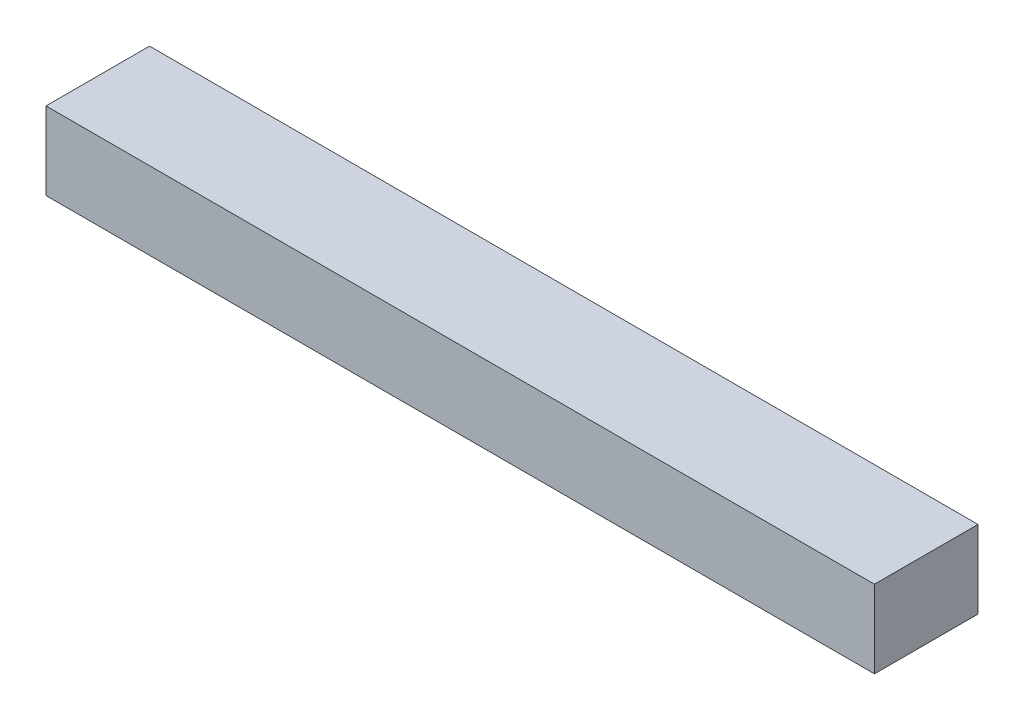
ISO-10303-21;
HEADER;
FILE_DESCRIPTION(('STEP AP214'),'2;1');
FILE_NAME('part.step','',(''),(''),'','','');
FILE_SCHEMA(('AUTOMOTIVE_DESIGN { 1 0 10303 214 1 1 1 1 }'));
ENDSEC;
DATA;
#1=APPLICATION_CONTEXT('core data for automotive mechanical design processes');
#2=APPLICATION_PROTOCOL_DEFINITION('international standard','automotive_design',2000,#1);
#3=PRODUCT_CONTEXT('',#1,'mechanical');
#4=PRODUCT('Part','Part','',(#3));
#5=PRODUCT_RELATED_PRODUCT_CATEGORY('part','',(#4));
#6=PRODUCT_DEFINITION_FORMATION('','',#4);
#7=PRODUCT_DEFINITION_CONTEXT('part definition',#1,'design');
#8=PRODUCT_DEFINITION('design','',#6,#7);
#9=PRODUCT_DEFINITION_SHAPE('','',#8);
#10=(LENGTH_UNIT() NAMED_UNIT(*) SI_UNIT(.MILLI.,.METRE.));
#11=(NAMED_UNIT(*) PLANE_ANGLE_UNIT() SI_UNIT($,.RADIAN.));
#12=(NAMED_UNIT(*) SI_UNIT($,.STERADIAN.) SOLID_ANGLE_UNIT());
#13=UNCERTAINTY_MEASURE_WITH_UNIT(LENGTH_MEASURE(1.E-05),#10,'distance_accuracy_value','');
#14=(GEOMETRIC_REPRESENTATION_CONTEXT(3) GLOBAL_UNCERTAINTY_ASSIGNED_CONTEXT((#13)) GLOBAL_UNIT_ASSIGNED_CONTEXT((#10,
#11,#12)) REPRESENTATION_CONTEXT('',''));
#15=CARTESIAN_POINT('',(0.,0.,0.));
#16=DIRECTION('',(0.,0.,1.));
#17=DIRECTION('',(1.,0.,0.));
#18=AXIS2_PLACEMENT_3D('',#15,#16,#17);
#19=CARTESIAN_POINT('',(-64.,-6.,-16.));
#20=DIRECTION('',(-1.,0.,0.));
#21=DIRECTION('',(0.,0.,1.));
#22=AXIS2_PLACEMENT_3D('',#19,#20,#21);
#23=PLANE('',#22);
#24=DIRECTION('',(0.,-1.,0.));
#25=VECTOR('',#24,1.);
#26=CARTESIAN_POINT('',(-64.,-6.,0.));
#27=LINE('',#26,#25);
#28=CARTESIAN_POINT('',(-64.,6.,0.));
#29=VERTEX_POINT('',#28);
#30=CARTESIAN_POINT('',(-64.,-6.,0.));
#31=VERTEX_POINT('',#30);
#32=EDGE_CURVE('E103',#29,#31,#27,.T.);
#33=ORIENTED_EDGE('',*,*,#32,.F.);
#34=DIRECTION('',(0.,0.,1.));
#35=VECTOR('',#34,1.);
#36=CARTESIAN_POINT('',(-64.,6.,-16.));
#37=LINE('',#36,#35);
#38=CARTESIAN_POINT('',(-64.,6.,-16.));
#39=VERTEX_POINT('',#38);
#40=EDGE_CURVE('E11',#39,#29,#37,.T.);
#41=ORIENTED_EDGE('',*,*,#40,.F.);
#42=DIRECTION('',(0.,-1.,0.));
#43=VECTOR('',#42,1.);
#44=CARTESIAN_POINT('',(-64.,-6.,-16.));
#45=LINE('',#44,#43);
#46=CARTESIAN_POINT('',(-64.,-6.,-16.));
#47=VERTEX_POINT('',#46);
#48=EDGE_CURVE('E97',#39,#47,#45,.T.);
#49=ORIENTED_EDGE('',*,*,#48,.T.);
#50=DIRECTION('',(0.,0.,1.));
#51=VECTOR('',#50,1.);
#52=CARTESIAN_POINT('',(-64.,-6.,-16.));
#53=LINE('',#52,#51);
#54=EDGE_CURVE('E42',#47,#31,#53,.T.);
#55=ORIENTED_EDGE('',*,*,#54,.T.);
#56=EDGE_LOOP('',(#33,#41,#49,#55));
#57=FACE_BOUND('',#56,.T.);
#58=ADVANCED_FACE('F39',(#57),#23,.T.);
#59=CARTESIAN_POINT('',(-64.,6.,-16.));
#60=DIRECTION('',(0.,1.,0.));
#61=DIRECTION('',(0.,0.,1.));
#62=AXIS2_PLACEMENT_3D('',#59,#60,#61);
#63=PLANE('',#62);
#64=DIRECTION('',(-1.,0.,0.));
#65=VECTOR('',#64,1.);
#66=CARTESIAN_POINT('',(-64.,6.,0.));
#67=LINE('',#66,#65);
#68=CARTESIAN_POINT('',(64.,6.,0.));
#69=VERTEX_POINT('',#68);
#70=EDGE_CURVE('E99',#69,#29,#67,.T.);
#71=ORIENTED_EDGE('',*,*,#70,.F.);
#72=DIRECTION('',(0.,0.,1.));
#73=VECTOR('',#72,1.);
#74=CARTESIAN_POINT('',(64.,6.,-16.));
#75=LINE('',#74,#73);
#76=CARTESIAN_POINT('',(64.,6.,-16.));
#77=VERTEX_POINT('',#76);
#78=EDGE_CURVE('E48',#77,#69,#75,.T.);
#79=ORIENTED_EDGE('',*,*,#78,.F.);
#80=DIRECTION('',(-1.,0.,0.));
#81=VECTOR('',#80,1.);
#82=CARTESIAN_POINT('',(-64.,6.,-16.));
#83=LINE('',#82,#81);
#84=EDGE_CURVE('E94',#77,#39,#83,.T.);
#85=ORIENTED_EDGE('',*,*,#84,.T.);
#86=ORIENTED_EDGE('',*,*,#40,.T.);
#87=EDGE_LOOP('',(#71,#79,#85,#86));
#88=FACE_BOUND('',#87,.T.);
#89=ADVANCED_FACE('F113',(#88),#63,.T.);
#90=CARTESIAN_POINT('',(64.,-6.,-16.));
#91=DIRECTION('',(1.,0.,0.));
#92=DIRECTION('',(0.,0.,-1.));
#93=AXIS2_PLACEMENT_3D('',#90,#91,#92);
#94=PLANE('',#93);
#95=DIRECTION('',(0.,1.,0.));
#96=VECTOR('',#95,1.);
#97=CARTESIAN_POINT('',(64.,-6.,0.));
#98=LINE('',#97,#96);
#99=CARTESIAN_POINT('',(64.,-6.,0.));
#100=VERTEX_POINT('',#99);
#101=EDGE_CURVE('E89',#100,#69,#98,.T.);
#102=ORIENTED_EDGE('',*,*,#101,.F.);
#103=DIRECTION('',(0.,0.,1.));
#104=VECTOR('',#103,1.);
#105=CARTESIAN_POINT('',(64.,-6.,-16.));
#106=LINE('',#105,#104);
#107=CARTESIAN_POINT('',(64.,-6.,-16.));
#108=VERTEX_POINT('',#107);
#109=EDGE_CURVE('E84',#108,#100,#106,.T.);
#110=ORIENTED_EDGE('',*,*,#109,.F.);
#111=DIRECTION('',(0.,1.,0.));
#112=VECTOR('',#111,1.);
#113=CARTESIAN_POINT('',(64.,-6.,-16.));
#114=LINE('',#113,#112);
#115=EDGE_CURVE('E87',#108,#77,#114,.T.);
#116=ORIENTED_EDGE('',*,*,#115,.T.);
#117=ORIENTED_EDGE('',*,*,#78,.T.);
#118=EDGE_LOOP('',(#102,#110,#116,#117));
#119=FACE_BOUND('',#118,.T.);
#120=ADVANCED_FACE('F86',(#119),#94,.T.);
#121=CARTESIAN_POINT('',(-64.,-6.,-16.));
#122=DIRECTION('',(0.,-1.,0.));
#123=DIRECTION('',(0.,0.,-1.));
#124=AXIS2_PLACEMENT_3D('',#121,#122,#123);
#125=PLANE('',#124);
#126=DIRECTION('',(1.,0.,0.));
#127=VECTOR('',#126,1.);
#128=CARTESIAN_POINT('',(-64.,-6.,0.));
#129=LINE('',#128,#127);
#130=EDGE_CURVE('E106',#31,#100,#129,.T.);
#131=ORIENTED_EDGE('',*,*,#130,.F.);
#132=ORIENTED_EDGE('',*,*,#54,.F.);
#133=DIRECTION('',(1.,0.,0.));
#134=VECTOR('',#133,1.);
#135=CARTESIAN_POINT('',(-64.,-6.,-16.));
#136=LINE('',#135,#134);
#137=EDGE_CURVE('E93',#47,#108,#136,.T.);
#138=ORIENTED_EDGE('',*,*,#137,.T.);
#139=ORIENTED_EDGE('',*,*,#109,.T.);
#140=EDGE_LOOP('',(#131,#132,#138,#139));
#141=FACE_BOUND('',#140,.T.);
#142=ADVANCED_FACE('F96',(#141),#125,.T.);
#143=CARTESIAN_POINT('',(0.,0.,-16.));
#144=DIRECTION('',(0.,0.,-1.));
#145=DIRECTION('',(-1.,0.,0.));
#146=AXIS2_PLACEMENT_3D('',#143,#144,#145);
#147=PLANE('',#146);
#148=ORIENTED_EDGE('',*,*,#48,.F.);
#149=ORIENTED_EDGE('',*,*,#84,.F.);
#150=ORIENTED_EDGE('',*,*,#115,.F.);
#151=ORIENTED_EDGE('',*,*,#137,.F.);
#152=EDGE_LOOP('',(#148,#149,#150,#151));
#153=FACE_BOUND('',#152,.T.);
#154=ADVANCED_FACE('F92',(#153),#147,.T.);
#155=CARTESIAN_POINT('',(0.,0.,0.));
#156=DIRECTION('',(0.,0.,-1.));
#157=DIRECTION('',(-1.,0.,0.));
#158=AXIS2_PLACEMENT_3D('',#155,#156,#157);
#159=PLANE('',#158);
#160=ORIENTED_EDGE('',*,*,#32,.T.);
#161=ORIENTED_EDGE('',*,*,#130,.T.);
#162=ORIENTED_EDGE('',*,*,#101,.T.);
#163=ORIENTED_EDGE('',*,*,#70,.T.);
#164=EDGE_LOOP('',(#160,#161,#162,#163));
#165=FACE_BOUND('',#164,.T.);
#166=ADVANCED_FACE('F112',(#165),#159,.F.);
#167=CLOSED_SHELL('',(#58,#89,#120,#142,#154,#166));
#168=MANIFOLD_SOLID_BREP('B2',#167);
#169=ADVANCED_BREP_SHAPE_REPRESENTATION('',(#18,#168),#14);
#170=SHAPE_DEFINITION_REPRESENTATION(#9,#169);
ENDSEC;
END-ISO-10303-21;
